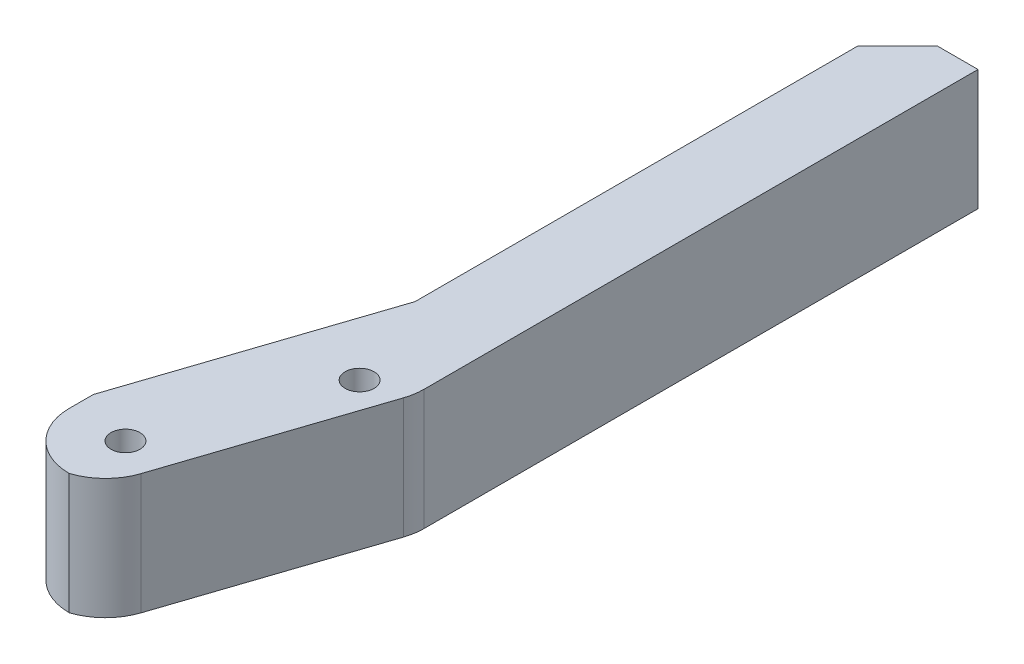
ISO-10303-21;
HEADER;
FILE_DESCRIPTION(('STEP AP214'),'2;1');
FILE_NAME('part.step','',(''),(''),'','','');
FILE_SCHEMA(('AUTOMOTIVE_DESIGN { 1 0 10303 214 1 1 1 1 }'));
ENDSEC;
DATA;
#1=APPLICATION_CONTEXT('core data for automotive mechanical design processes');
#2=APPLICATION_PROTOCOL_DEFINITION('international standard','automotive_design',2000,#1);
#3=PRODUCT_CONTEXT('',#1,'mechanical');
#4=PRODUCT('Part','Part','',(#3));
#5=PRODUCT_RELATED_PRODUCT_CATEGORY('part','',(#4));
#6=PRODUCT_DEFINITION_FORMATION('','',#4);
#7=PRODUCT_DEFINITION_CONTEXT('part definition',#1,'design');
#8=PRODUCT_DEFINITION('design','',#6,#7);
#9=PRODUCT_DEFINITION_SHAPE('','',#8);
#10=(LENGTH_UNIT() NAMED_UNIT(*) SI_UNIT(.MILLI.,.METRE.));
#11=(NAMED_UNIT(*) PLANE_ANGLE_UNIT() SI_UNIT($,.RADIAN.));
#12=(NAMED_UNIT(*) SI_UNIT($,.STERADIAN.) SOLID_ANGLE_UNIT());
#13=UNCERTAINTY_MEASURE_WITH_UNIT(LENGTH_MEASURE(1.E-05),#10,'distance_accuracy_value','');
#14=(GEOMETRIC_REPRESENTATION_CONTEXT(3) GLOBAL_UNCERTAINTY_ASSIGNED_CONTEXT((#13)) GLOBAL_UNIT_ASSIGNED_CONTEXT((#10,
#11,#12)) REPRESENTATION_CONTEXT('',''));
#15=CARTESIAN_POINT('',(0.,0.,0.));
#16=DIRECTION('',(0.,0.,1.));
#17=DIRECTION('',(1.,0.,0.));
#18=AXIS2_PLACEMENT_3D('',#15,#16,#17);
#19=CARTESIAN_POINT('',(10.9289617486339,15.,-0.291438979963598));
#20=DIRECTION('',(0.948683298050514,0.,0.316227766016838));
#21=DIRECTION('',(0.316227766016838,0.,-0.948683298050514));
#22=AXIS2_PLACEMENT_3D('',#19,#20,#21);
#23=PLANE('',#22);
#24=DIRECTION('',(-0.316227766016838,0.,0.948683298050514));
#25=VECTOR('',#24,1.);
#26=CARTESIAN_POINT('',(10.9289617486339,0.,-0.291438979963598));
#27=LINE('',#26,#25);
#28=CARTESIAN_POINT('',(10.9289617486339,0.,-0.291438979963598));
#29=VERTEX_POINT('',#28);
#30=CARTESIAN_POINT('',(0.928961748633886,0.,29.7085610200364));
#31=VERTEX_POINT('',#30);
#32=EDGE_CURVE('E152',#29,#31,#27,.T.);
#33=ORIENTED_EDGE('',*,*,#32,.T.);
#34=DIRECTION('',(0.,-1.,0.));
#35=VECTOR('',#34,1.);
#36=CARTESIAN_POINT('',(0.928961748633886,15.,29.7085610200364));
#37=LINE('',#36,#35);
#38=CARTESIAN_POINT('',(0.928961748633886,15.,29.7085610200364));
#39=VERTEX_POINT('',#38);
#40=EDGE_CURVE('E131',#39,#31,#37,.T.);
#41=ORIENTED_EDGE('',*,*,#40,.F.);
#42=DIRECTION('',(-0.316227766016838,0.,0.948683298050514));
#43=VECTOR('',#42,1.);
#44=CARTESIAN_POINT('',(10.9289617486339,15.,-0.291438979963598));
#45=LINE('',#44,#43);
#46=CARTESIAN_POINT('',(10.9289617486339,15.,-0.291438979963598));
#47=VERTEX_POINT('',#46);
#48=EDGE_CURVE('E139',#47,#39,#45,.T.);
#49=ORIENTED_EDGE('',*,*,#48,.F.);
#50=DIRECTION('',(0.,-1.,0.));
#51=VECTOR('',#50,1.);
#52=CARTESIAN_POINT('',(10.9289617486339,15.,-0.291438979963598));
#53=LINE('',#52,#51);
#54=EDGE_CURVE('E163',#47,#29,#53,.T.);
#55=ORIENTED_EDGE('',*,*,#54,.T.);
#56=EDGE_LOOP('',(#33,#41,#49,#55));
#57=FACE_BOUND('',#56,.T.);
#58=ADVANCED_FACE('F47',(#57),#23,.F.);
#59=CARTESIAN_POINT('',(0.928961748633886,15.,39.7085610200364));
#60=DIRECTION('',(1.,0.,0.));
#61=DIRECTION('',(0.,0.,-1.));
#62=AXIS2_PLACEMENT_3D('',#59,#60,#61);
#63=PLANE('',#62);
#64=DIRECTION('',(0.,0.,1.));
#65=VECTOR('',#64,1.);
#66=CARTESIAN_POINT('',(0.928961748633886,0.,39.7085610200364));
#67=LINE('',#66,#65);
#68=CARTESIAN_POINT('',(0.928961748633886,0.,32.7085610200364));
#69=VERTEX_POINT('',#68);
#70=EDGE_CURVE('E227',#31,#69,#67,.T.);
#71=ORIENTED_EDGE('',*,*,#70,.T.);
#72=DIRECTION('',(0.,-1.,0.));
#73=VECTOR('',#72,1.);
#74=CARTESIAN_POINT('',(0.928961748633886,15.,32.7085610200364));
#75=LINE('',#74,#73);
#76=CARTESIAN_POINT('',(0.928961748633886,15.,32.7085610200364));
#77=VERTEX_POINT('',#76);
#78=EDGE_CURVE('E134',#69,#77,#75,.F.);
#79=ORIENTED_EDGE('',*,*,#78,.T.);
#80=DIRECTION('',(0.,0.,1.));
#81=VECTOR('',#80,1.);
#82=CARTESIAN_POINT('',(0.928961748633886,15.,39.7085610200364));
#83=LINE('',#82,#81);
#84=EDGE_CURVE('E126',#39,#77,#83,.T.);
#85=ORIENTED_EDGE('',*,*,#84,.F.);
#86=ORIENTED_EDGE('',*,*,#40,.T.);
#87=EDGE_LOOP('',(#71,#79,#85,#86));
#88=FACE_BOUND('',#87,.T.);
#89=ADVANCED_FACE('F129',(#88),#63,.F.);
#90=CARTESIAN_POINT('',(20.9289617486339,15.,9.70856102003644));
#91=DIRECTION('',(-0.948683298050514,0.,-0.316227766016838));
#92=DIRECTION('',(-0.316227766016838,0.,0.948683298050514));
#93=AXIS2_PLACEMENT_3D('',#90,#91,#92);
#94=PLANE('',#93);
#95=DIRECTION('',(0.316227766016838,0.,-0.948683298050514));
#96=VECTOR('',#95,1.);
#97=CARTESIAN_POINT('',(20.9289617486339,0.,9.70856102003644));
#98=LINE('',#97,#96);
#99=CARTESIAN_POINT('',(12.4106659473751,0.,35.2634484238127));
#100=VERTEX_POINT('',#99);
#101=CARTESIAN_POINT('',(20.5697448349875,0.,10.7862117609756));
#102=VERTEX_POINT('',#101);
#103=EDGE_CURVE('E231',#100,#102,#98,.T.);
#104=ORIENTED_EDGE('',*,*,#103,.T.);
#105=DIRECTION('',(0.,-1.,0.));
#106=VECTOR('',#105,1.);
#107=CARTESIAN_POINT('',(20.5697448349875,15.,10.7862117609756));
#108=LINE('',#107,#106);
#109=CARTESIAN_POINT('',(20.5697448349875,15.,10.7862117609756));
#110=VERTEX_POINT('',#109);
#111=EDGE_CURVE('E191',#102,#110,#108,.F.);
#112=ORIENTED_EDGE('',*,*,#111,.T.);
#113=DIRECTION('',(0.316227766016838,0.,-0.948683298050514));
#114=VECTOR('',#113,1.);
#115=CARTESIAN_POINT('',(20.9289617486339,15.,9.70856102003644));
#116=LINE('',#115,#114);
#117=CARTESIAN_POINT('',(12.4106659473751,15.,35.2634484238127));
#118=VERTEX_POINT('',#117);
#119=EDGE_CURVE('E138',#118,#110,#116,.T.);
#120=ORIENTED_EDGE('',*,*,#119,.F.);
#121=DIRECTION('',(0.,-1.,0.));
#122=VECTOR('',#121,1.);
#123=CARTESIAN_POINT('',(12.4106659473751,15.,35.2634484238127));
#124=LINE('',#123,#122);
#125=EDGE_CURVE('E174',#118,#100,#124,.T.);
#126=ORIENTED_EDGE('',*,*,#125,.T.);
#127=EDGE_LOOP('',(#104,#112,#120,#126));
#128=FACE_BOUND('',#127,.T.);
#129=ADVANCED_FACE('F255',(#128),#94,.F.);
#130=CARTESIAN_POINT('',(20.9289617486339,15.,9.70856102003644));
#131=DIRECTION('',(-1.,0.,0.));
#132=DIRECTION('',(0.,0.,1.));
#133=AXIS2_PLACEMENT_3D('',#130,#131,#132);
#134=PLANE('',#133);
#135=DIRECTION('',(0.,0.,-1.));
#136=VECTOR('',#135,1.);
#137=CARTESIAN_POINT('',(20.9289617486339,15.,9.70856102003644));
#138=LINE('',#137,#136);
#139=CARTESIAN_POINT('',(20.9289617486339,15.,8.57261739885779));
#140=VERTEX_POINT('',#139);
#141=CARTESIAN_POINT('',(20.9289617486339,15.,-60.2914389799636));
#142=VERTEX_POINT('',#141);
#143=EDGE_CURVE('E221',#140,#142,#138,.T.);
#144=ORIENTED_EDGE('',*,*,#143,.F.);
#145=DIRECTION('',(0.,-1.,0.));
#146=VECTOR('',#145,1.);
#147=CARTESIAN_POINT('',(20.9289617486339,15.,8.57261739885779));
#148=LINE('',#147,#146);
#149=CARTESIAN_POINT('',(20.9289617486339,0.,8.57261739885779));
#150=VERTEX_POINT('',#149);
#151=EDGE_CURVE('E184',#140,#150,#148,.T.);
#152=ORIENTED_EDGE('',*,*,#151,.T.);
#153=DIRECTION('',(0.,0.,-1.));
#154=VECTOR('',#153,1.);
#155=CARTESIAN_POINT('',(20.9289617486339,0.,9.70856102003644));
#156=LINE('',#155,#154);
#157=CARTESIAN_POINT('',(20.9289617486339,0.,-60.2914389799636));
#158=VERTEX_POINT('',#157);
#159=EDGE_CURVE('E213',#150,#158,#156,.T.);
#160=ORIENTED_EDGE('',*,*,#159,.T.);
#161=DIRECTION('',(0.,-1.,0.));
#162=VECTOR('',#161,1.);
#163=CARTESIAN_POINT('',(20.9289617486339,15.,-60.2914389799636));
#164=LINE('',#163,#162);
#165=EDGE_CURVE('E155',#142,#158,#164,.T.);
#166=ORIENTED_EDGE('',*,*,#165,.F.);
#167=EDGE_LOOP('',(#144,#152,#160,#166));
#168=FACE_BOUND('',#167,.T.);
#169=ADVANCED_FACE('F239',(#168),#134,.F.);
#170=CARTESIAN_POINT('',(20.9289617486339,15.,-60.2914389799636));
#171=DIRECTION('',(0.,0.,1.));
#172=DIRECTION('',(1.,0.,0.));
#173=AXIS2_PLACEMENT_3D('',#170,#171,#172);
#174=PLANE('',#173);
#175=DIRECTION('',(-1.,0.,0.));
#176=VECTOR('',#175,1.);
#177=CARTESIAN_POINT('',(20.9289617486339,0.,-60.2914389799636));
#178=LINE('',#177,#176);
#179=CARTESIAN_POINT('',(15.9289617486339,0.,-60.2914389799636));
#180=VERTEX_POINT('',#179);
#181=EDGE_CURVE('E210',#158,#180,#178,.T.);
#182=ORIENTED_EDGE('',*,*,#181,.T.);
#183=DIRECTION('',(0.,1.,0.));
#184=VECTOR('',#183,1.);
#185=CARTESIAN_POINT('',(15.9289617486339,15.,-60.2914389799636));
#186=LINE('',#185,#184);
#187=CARTESIAN_POINT('',(15.9289617486339,15.,-60.2914389799636));
#188=VERTEX_POINT('',#187);
#189=EDGE_CURVE('E57',#180,#188,#186,.T.);
#190=ORIENTED_EDGE('',*,*,#189,.T.);
#191=DIRECTION('',(-1.,0.,0.));
#192=VECTOR('',#191,1.);
#193=CARTESIAN_POINT('',(20.9289617486339,15.,-60.2914389799636));
#194=LINE('',#193,#192);
#195=EDGE_CURVE('E218',#142,#188,#194,.T.);
#196=ORIENTED_EDGE('',*,*,#195,.F.);
#197=ORIENTED_EDGE('',*,*,#165,.T.);
#198=EDGE_LOOP('',(#182,#190,#196,#197));
#199=FACE_BOUND('',#198,.T.);
#200=ADVANCED_FACE('F241',(#199),#174,.F.);
#201=CARTESIAN_POINT('',(10.9289617486339,15.,-60.2914389799636));
#202=DIRECTION('',(1.,0.,0.));
#203=DIRECTION('',(0.,0.,-1.));
#204=AXIS2_PLACEMENT_3D('',#201,#202,#203);
#205=PLANE('',#204);
#206=DIRECTION('',(0.,0.,1.));
#207=VECTOR('',#206,1.);
#208=CARTESIAN_POINT('',(10.9289617486339,15.,-60.2914389799636));
#209=LINE('',#208,#207);
#210=CARTESIAN_POINT('',(10.9289617486339,15.,-55.2914389799636));
#211=VERTEX_POINT('',#210);
#212=EDGE_CURVE('E144',#211,#47,#209,.T.);
#213=ORIENTED_EDGE('',*,*,#212,.F.);
#214=DIRECTION('',(0.,-1.,0.));
#215=VECTOR('',#214,1.);
#216=CARTESIAN_POINT('',(10.9289617486339,15.,-55.2914389799636));
#217=LINE('',#216,#215);
#218=CARTESIAN_POINT('',(10.9289617486339,0.,-55.2914389799636));
#219=VERTEX_POINT('',#218);
#220=EDGE_CURVE('E197',#211,#219,#217,.T.);
#221=ORIENTED_EDGE('',*,*,#220,.T.);
#222=DIRECTION('',(0.,0.,1.));
#223=VECTOR('',#222,1.);
#224=CARTESIAN_POINT('',(10.9289617486339,0.,-60.2914389799636));
#225=LINE('',#224,#223);
#226=EDGE_CURVE('E149',#219,#29,#225,.T.);
#227=ORIENTED_EDGE('',*,*,#226,.T.);
#228=ORIENTED_EDGE('',*,*,#54,.F.);
#229=EDGE_LOOP('',(#213,#221,#227,#228));
#230=FACE_BOUND('',#229,.T.);
#231=ADVANCED_FACE('F205',(#230),#205,.F.);
#232=CARTESIAN_POINT('',(0.,15.,0.));
#233=DIRECTION('',(0.,-1.,0.));
#234=DIRECTION('',(0.,0.,-1.));
#235=AXIS2_PLACEMENT_3D('',#232,#233,#234);
#236=PLANE('',#235);
#237=CARTESIAN_POINT('',(15.9289617486339,15.,11.5991963172005));
#238=DIRECTION('',(0.,1.,0.));
#239=DIRECTION('',(0.,0.,1.));
#240=AXIS2_PLACEMENT_3D('',#237,#238,#239);
#241=CIRCLE('',#240,1.8);
#242=CARTESIAN_POINT('',(15.9289617486339,15.,13.3991963172005));
#243=VERTEX_POINT('',#242);
#244=EDGE_CURVE('E294',#243,#243,#241,.T.);
#245=ORIENTED_EDGE('',*,*,#244,.F.);
#246=EDGE_LOOP('',(#245));
#247=FACE_BOUND('',#246,.T.);
#248=CARTESIAN_POINT('',(7.92896174863389,15.,32.7085610200364));
#249=DIRECTION('',(0.,1.,0.));
#250=DIRECTION('',(0.,0.,1.));
#251=AXIS2_PLACEMENT_3D('',#248,#249,#250);
#252=CIRCLE('',#251,1.8);
#253=CARTESIAN_POINT('',(7.92896174863389,15.,34.5085610200365));
#254=VERTEX_POINT('',#253);
#255=EDGE_CURVE('E290',#254,#254,#252,.T.);
#256=ORIENTED_EDGE('',*,*,#255,.F.);
#257=EDGE_LOOP('',(#256));
#258=FACE_BOUND('',#257,.T.);
#259=ORIENTED_EDGE('',*,*,#195,.T.);
#260=DIRECTION('',(0.70710678118655,0.,-0.707106781186545));
#261=VECTOR('',#260,1.);
#262=CARTESIAN_POINT('',(10.9289617486339,15.,-55.2914389799636));
#263=LINE('',#262,#261);
#264=EDGE_CURVE('E11',#188,#211,#263,.F.);
#265=ORIENTED_EDGE('',*,*,#264,.T.);
#266=ORIENTED_EDGE('',*,*,#212,.T.);
#267=ORIENTED_EDGE('',*,*,#48,.T.);
#268=ORIENTED_EDGE('',*,*,#84,.T.);
#269=CARTESIAN_POINT('',(7.92896174863389,15.,32.7085610200364));
#270=DIRECTION('',(0.,-1.,0.));
#271=DIRECTION('',(0.,0.,-1.));
#272=AXIS2_PLACEMENT_3D('',#269,#270,#271);
#273=CIRCLE('',#272,7.);
#274=CARTESIAN_POINT('',(7.92896174863388,15.,39.7085610200364));
#275=VERTEX_POINT('',#274);
#276=EDGE_CURVE('E171',#77,#275,#273,.F.);
#277=ORIENTED_EDGE('',*,*,#276,.T.);
#278=CARTESIAN_POINT('',(5.76988286102153,15.,33.0498540616949));
#279=DIRECTION('',(0.,-1.,0.));
#280=DIRECTION('',(0.,0.,-1.));
#281=AXIS2_PLACEMENT_3D('',#278,#279,#280);
#282=CIRCLE('',#281,7.);
#283=EDGE_CURVE('E181',#275,#118,#282,.F.);
#284=ORIENTED_EDGE('',*,*,#283,.T.);
#285=ORIENTED_EDGE('',*,*,#119,.T.);
#286=CARTESIAN_POINT('',(13.9289617486339,15.,8.57261739885779));
#287=DIRECTION('',(0.,-1.,0.));
#288=DIRECTION('',(0.,0.,-1.));
#289=AXIS2_PLACEMENT_3D('',#286,#287,#288);
#290=CIRCLE('',#289,7.);
#291=EDGE_CURVE('E194',#110,#140,#290,.F.);
#292=ORIENTED_EDGE('',*,*,#291,.T.);
#293=ORIENTED_EDGE('',*,*,#143,.T.);
#294=EDGE_LOOP('',(#259,#265,#266,#267,#268,#277,#284,#285,#292,#293));
#295=FACE_BOUND('',#294,.T.);
#296=ADVANCED_FACE('F142',(#247,#258,#295),#236,.F.);
#297=CARTESIAN_POINT('',(0.,0.,0.));
#298=DIRECTION('',(0.,-1.,0.));
#299=DIRECTION('',(0.,0.,-1.));
#300=AXIS2_PLACEMENT_3D('',#297,#298,#299);
#301=PLANE('',#300);
#302=CARTESIAN_POINT('',(15.9289617486339,0.,11.5991963172005));
#303=DIRECTION('',(0.,1.,0.));
#304=DIRECTION('',(0.,0.,1.));
#305=AXIS2_PLACEMENT_3D('',#302,#303,#304);
#306=CIRCLE('',#305,1.8);
#307=CARTESIAN_POINT('',(15.9289617486339,0.,13.3991963172005));
#308=VERTEX_POINT('',#307);
#309=EDGE_CURVE('E228',#308,#308,#306,.T.);
#310=ORIENTED_EDGE('',*,*,#309,.T.);
#311=EDGE_LOOP('',(#310));
#312=FACE_BOUND('',#311,.T.);
#313=CARTESIAN_POINT('',(7.92896174863389,0.,32.7085610200364));
#314=DIRECTION('',(0.,1.,0.));
#315=DIRECTION('',(0.,0.,1.));
#316=AXIS2_PLACEMENT_3D('',#313,#314,#315);
#317=CIRCLE('',#316,1.8);
#318=CARTESIAN_POINT('',(7.92896174863389,0.,34.5085610200365));
#319=VERTEX_POINT('',#318);
#320=EDGE_CURVE('E286',#319,#319,#317,.T.);
#321=ORIENTED_EDGE('',*,*,#320,.T.);
#322=EDGE_LOOP('',(#321));
#323=FACE_BOUND('',#322,.T.);
#324=ORIENTED_EDGE('',*,*,#226,.F.);
#325=DIRECTION('',(-0.70710678118655,0.,0.707106781186545));
#326=VECTOR('',#325,1.);
#327=CARTESIAN_POINT('',(-22.1812386156649,0.,-22.181238615665));
#328=LINE('',#327,#326);
#329=EDGE_CURVE('E71',#219,#180,#328,.F.);
#330=ORIENTED_EDGE('',*,*,#329,.T.);
#331=ORIENTED_EDGE('',*,*,#181,.F.);
#332=ORIENTED_EDGE('',*,*,#159,.F.);
#333=CARTESIAN_POINT('',(13.9289617486339,0.,8.57261739885779));
#334=DIRECTION('',(0.,-1.,0.));
#335=DIRECTION('',(0.,0.,-1.));
#336=AXIS2_PLACEMENT_3D('',#333,#334,#335);
#337=CIRCLE('',#336,7.);
#338=EDGE_CURVE('E188',#150,#102,#337,.T.);
#339=ORIENTED_EDGE('',*,*,#338,.T.);
#340=ORIENTED_EDGE('',*,*,#103,.F.);
#341=CARTESIAN_POINT('',(5.76988286102153,0.,33.0498540616949));
#342=DIRECTION('',(0.,-1.,0.));
#343=DIRECTION('',(0.,0.,-1.));
#344=AXIS2_PLACEMENT_3D('',#341,#342,#343);
#345=CIRCLE('',#344,7.);
#346=CARTESIAN_POINT('',(7.92896174863388,0.,39.7085610200364));
#347=VERTEX_POINT('',#346);
#348=EDGE_CURVE('E178',#100,#347,#345,.T.);
#349=ORIENTED_EDGE('',*,*,#348,.T.);
#350=CARTESIAN_POINT('',(7.92896174863389,0.,32.7085610200364));
#351=DIRECTION('',(0.,-1.,0.));
#352=DIRECTION('',(0.,0.,-1.));
#353=AXIS2_PLACEMENT_3D('',#350,#351,#352);
#354=CIRCLE('',#353,7.);
#355=EDGE_CURVE('E160',#347,#69,#354,.T.);
#356=ORIENTED_EDGE('',*,*,#355,.T.);
#357=ORIENTED_EDGE('',*,*,#70,.F.);
#358=ORIENTED_EDGE('',*,*,#32,.F.);
#359=EDGE_LOOP('',(#324,#330,#331,#332,#339,#340,#349,#356,#357,#358));
#360=FACE_BOUND('',#359,.T.);
#361=ADVANCED_FACE('F208',(#312,#323,#360),#301,.T.);
#362=CARTESIAN_POINT('',(7.92896174863389,15.,32.7085610200364));
#363=DIRECTION('',(0.,-1.,0.));
#364=DIRECTION('',(0.,0.,-1.));
#365=AXIS2_PLACEMENT_3D('',#362,#363,#364);
#366=CYLINDRICAL_SURFACE('',#365,7.);
#367=ORIENTED_EDGE('',*,*,#276,.F.);
#368=ORIENTED_EDGE('',*,*,#78,.F.);
#369=ORIENTED_EDGE('',*,*,#355,.F.);
#370=DIRECTION('',(0.,-1.,0.));
#371=VECTOR('',#370,1.);
#372=CARTESIAN_POINT('',(7.92896174863388,15.,39.7085610200364));
#373=LINE('',#372,#371);
#374=EDGE_CURVE('E154',#275,#347,#373,.T.);
#375=ORIENTED_EDGE('',*,*,#374,.F.);
#376=EDGE_LOOP('',(#367,#368,#369,#375));
#377=FACE_BOUND('',#376,.T.);
#378=ADVANCED_FACE('F259',(#377),#366,.T.);
#379=CARTESIAN_POINT('',(7.92896174863389,0.,32.7085610200364));
#380=DIRECTION('',(0.,1.,0.));
#381=DIRECTION('',(0.,0.,1.));
#382=AXIS2_PLACEMENT_3D('',#379,#380,#381);
#383=CYLINDRICAL_SURFACE('',#382,1.8);
#384=ORIENTED_EDGE('',*,*,#320,.F.);
#385=EDGE_LOOP('',(#384));
#386=FACE_BOUND('',#385,.T.);
#387=ORIENTED_EDGE('',*,*,#255,.T.);
#388=EDGE_LOOP('',(#387));
#389=FACE_BOUND('',#388,.T.);
#390=ADVANCED_FACE('F262',(#386,#389),#383,.F.);
#391=CARTESIAN_POINT('',(15.9289617486339,0.,11.5991963172005));
#392=DIRECTION('',(0.,1.,0.));
#393=DIRECTION('',(0.,0.,1.));
#394=AXIS2_PLACEMENT_3D('',#391,#392,#393);
#395=CYLINDRICAL_SURFACE('',#394,1.8);
#396=ORIENTED_EDGE('',*,*,#309,.F.);
#397=EDGE_LOOP('',(#396));
#398=FACE_BOUND('',#397,.T.);
#399=ORIENTED_EDGE('',*,*,#244,.T.);
#400=EDGE_LOOP('',(#399));
#401=FACE_BOUND('',#400,.T.);
#402=ADVANCED_FACE('F265',(#398,#401),#395,.F.);
#403=CARTESIAN_POINT('',(5.76988286102153,15.,33.0498540616949));
#404=DIRECTION('',(0.,-1.,0.));
#405=DIRECTION('',(0.,0.,-1.));
#406=AXIS2_PLACEMENT_3D('',#403,#404,#405);
#407=CYLINDRICAL_SURFACE('',#406,7.);
#408=ORIENTED_EDGE('',*,*,#283,.F.);
#409=ORIENTED_EDGE('',*,*,#374,.T.);
#410=ORIENTED_EDGE('',*,*,#348,.F.);
#411=ORIENTED_EDGE('',*,*,#125,.F.);
#412=EDGE_LOOP('',(#408,#409,#410,#411));
#413=FACE_BOUND('',#412,.T.);
#414=ADVANCED_FACE('F248',(#413),#407,.T.);
#415=CARTESIAN_POINT('',(13.9289617486339,15.,8.57261739885779));
#416=DIRECTION('',(0.,-1.,0.));
#417=DIRECTION('',(0.,0.,-1.));
#418=AXIS2_PLACEMENT_3D('',#415,#416,#417);
#419=CYLINDRICAL_SURFACE('',#418,7.);
#420=ORIENTED_EDGE('',*,*,#291,.F.);
#421=ORIENTED_EDGE('',*,*,#111,.F.);
#422=ORIENTED_EDGE('',*,*,#338,.F.);
#423=ORIENTED_EDGE('',*,*,#151,.F.);
#424=EDGE_LOOP('',(#420,#421,#422,#423));
#425=FACE_BOUND('',#424,.T.);
#426=ADVANCED_FACE('F243',(#425),#419,.T.);
#427=CARTESIAN_POINT('',(10.9289617486339,15.,-55.2914389799636));
#428=DIRECTION('',(0.707106781186545,0.,0.70710678118655));
#429=DIRECTION('',(0.,-1.,0.));
#430=AXIS2_PLACEMENT_3D('',#427,#428,#429);
#431=PLANE('',#430);
#432=ORIENTED_EDGE('',*,*,#264,.F.);
#433=ORIENTED_EDGE('',*,*,#189,.F.);
#434=ORIENTED_EDGE('',*,*,#329,.F.);
#435=ORIENTED_EDGE('',*,*,#220,.F.);
#436=EDGE_LOOP('',(#432,#433,#434,#435));
#437=FACE_BOUND('',#436,.T.);
#438=ADVANCED_FACE('F50',(#437),#431,.F.);
#439=CLOSED_SHELL('',(#58,#89,#129,#169,#200,#231,#296,#361,#378,#390,#402,#414,#426,#438));
#440=MANIFOLD_SOLID_BREP('B2',#439);
#441=ADVANCED_BREP_SHAPE_REPRESENTATION('',(#18,#440),#14);
#442=SHAPE_DEFINITION_REPRESENTATION(#9,#441);
ENDSEC;
END-ISO-10303-21;
